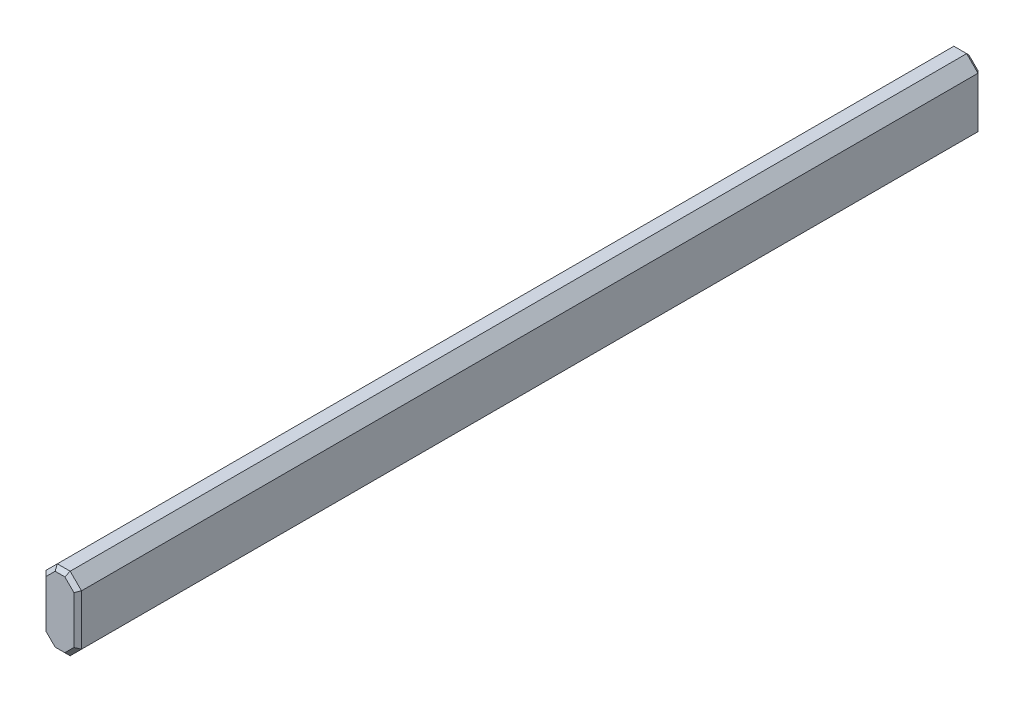
ISO-10303-21;
HEADER;
FILE_DESCRIPTION(('STEP AP214'),'2;1');
FILE_NAME('part.step','',(''),(''),'','','');
FILE_SCHEMA(('AUTOMOTIVE_DESIGN { 1 0 10303 214 1 1 1 1 }'));
ENDSEC;
DATA;
#1=APPLICATION_CONTEXT('core data for automotive mechanical design processes');
#2=APPLICATION_PROTOCOL_DEFINITION('international standard','automotive_design',2000,#1);
#3=PRODUCT_CONTEXT('',#1,'mechanical');
#4=PRODUCT('Part','Part','',(#3));
#5=PRODUCT_RELATED_PRODUCT_CATEGORY('part','',(#4));
#6=PRODUCT_DEFINITION_FORMATION('','',#4);
#7=PRODUCT_DEFINITION_CONTEXT('part definition',#1,'design');
#8=PRODUCT_DEFINITION('design','',#6,#7);
#9=PRODUCT_DEFINITION_SHAPE('','',#8);
#10=(LENGTH_UNIT() NAMED_UNIT(*) SI_UNIT(.MILLI.,.METRE.));
#11=(NAMED_UNIT(*) PLANE_ANGLE_UNIT() SI_UNIT($,.RADIAN.));
#12=(NAMED_UNIT(*) SI_UNIT($,.STERADIAN.) SOLID_ANGLE_UNIT());
#13=UNCERTAINTY_MEASURE_WITH_UNIT(LENGTH_MEASURE(1.E-05),#10,'distance_accuracy_value','');
#14=(GEOMETRIC_REPRESENTATION_CONTEXT(3) GLOBAL_UNCERTAINTY_ASSIGNED_CONTEXT((#13)) GLOBAL_UNIT_ASSIGNED_CONTEXT((#10,
#11,#12)) REPRESENTATION_CONTEXT('',''));
#15=CARTESIAN_POINT('',(0.,0.,0.));
#16=DIRECTION('',(0.,0.,1.));
#17=DIRECTION('',(1.,0.,0.));
#18=AXIS2_PLACEMENT_3D('',#15,#16,#17);
#19=CARTESIAN_POINT('',(2.35,-4.85,119.7));
#20=DIRECTION('',(-1.,0.,0.));
#21=DIRECTION('',(0.,-1.,0.));
#22=AXIS2_PLACEMENT_3D('',#19,#20,#21);
#23=PLANE('',#22);
#24=DIRECTION('',(0.,0.,1.));
#25=VECTOR('',#24,1.);
#26=CARTESIAN_POINT('',(2.35,3.34999999999999,119.7));
#27=LINE('',#26,#25);
#28=CARTESIAN_POINT('',(2.35,3.34999999999999,0.500000000000014));
#29=VERTEX_POINT('',#28);
#30=CARTESIAN_POINT('',(2.35,3.34999999999999,119.2));
#31=VERTEX_POINT('',#30);
#32=EDGE_CURVE('E307',#29,#31,#27,.T.);
#33=ORIENTED_EDGE('',*,*,#32,.T.);
#34=DIRECTION('',(0.,-1.,0.));
#35=VECTOR('',#34,1.);
#36=CARTESIAN_POINT('',(2.35,-3.35,119.2));
#37=LINE('',#36,#35);
#38=CARTESIAN_POINT('',(2.35,-3.35,119.2));
#39=VERTEX_POINT('',#38);
#40=EDGE_CURVE('E203',#31,#39,#37,.T.);
#41=ORIENTED_EDGE('',*,*,#40,.T.);
#42=DIRECTION('',(0.,0.,-1.));
#43=VECTOR('',#42,1.);
#44=CARTESIAN_POINT('',(2.35,-3.35,119.7));
#45=LINE('',#44,#43);
#46=CARTESIAN_POINT('',(2.35,-3.35,0.500000000000014));
#47=VERTEX_POINT('',#46);
#48=EDGE_CURVE('E179',#39,#47,#45,.T.);
#49=ORIENTED_EDGE('',*,*,#48,.T.);
#50=DIRECTION('',(0.,1.,0.));
#51=VECTOR('',#50,1.);
#52=CARTESIAN_POINT('',(2.35,-4.85,0.500000000000014));
#53=LINE('',#52,#51);
#54=EDGE_CURVE('E201',#47,#29,#53,.T.);
#55=ORIENTED_EDGE('',*,*,#54,.T.);
#56=EDGE_LOOP('',(#33,#41,#49,#55));
#57=FACE_BOUND('',#56,.T.);
#58=ADVANCED_FACE('F45',(#57),#23,.F.);
#59=CARTESIAN_POINT('',(2.35,4.85,119.7));
#60=DIRECTION('',(0.,-1.,0.));
#61=DIRECTION('',(1.,0.,0.));
#62=AXIS2_PLACEMENT_3D('',#59,#60,#61);
#63=PLANE('',#62);
#64=DIRECTION('',(0.,0.,1.));
#65=VECTOR('',#64,1.);
#66=CARTESIAN_POINT('',(-0.849999999999971,4.85,119.7));
#67=LINE('',#66,#65);
#68=CARTESIAN_POINT('',(-0.849999999999971,4.85,0.500000000000014));
#69=VERTEX_POINT('',#68);
#70=CARTESIAN_POINT('',(-0.849999999999971,4.85,119.2));
#71=VERTEX_POINT('',#70);
#72=EDGE_CURVE('E290',#69,#71,#67,.T.);
#73=ORIENTED_EDGE('',*,*,#72,.T.);
#74=DIRECTION('',(1.,0.,0.));
#75=VECTOR('',#74,1.);
#76=CARTESIAN_POINT('',(0.849999999999998,4.85,119.2));
#77=LINE('',#76,#75);
#78=CARTESIAN_POINT('',(0.849999999999998,4.85,119.2));
#79=VERTEX_POINT('',#78);
#80=EDGE_CURVE('E195',#71,#79,#77,.T.);
#81=ORIENTED_EDGE('',*,*,#80,.T.);
#82=DIRECTION('',(0.,0.,-1.));
#83=VECTOR('',#82,1.);
#84=CARTESIAN_POINT('',(0.849999999999998,4.85,119.7));
#85=LINE('',#84,#83);
#86=CARTESIAN_POINT('',(0.849999999999998,4.85,0.500000000000014));
#87=VERTEX_POINT('',#86);
#88=EDGE_CURVE('E298',#79,#87,#85,.T.);
#89=ORIENTED_EDGE('',*,*,#88,.T.);
#90=DIRECTION('',(-1.,0.,0.));
#91=VECTOR('',#90,1.);
#92=CARTESIAN_POINT('',(2.35,4.85,0.500000000000014));
#93=LINE('',#92,#91);
#94=EDGE_CURVE('E193',#87,#69,#93,.T.);
#95=ORIENTED_EDGE('',*,*,#94,.T.);
#96=EDGE_LOOP('',(#73,#81,#89,#95));
#97=FACE_BOUND('',#96,.T.);
#98=ADVANCED_FACE('F330',(#97),#63,.F.);
#99=CARTESIAN_POINT('',(-2.35,4.85,119.7));
#100=DIRECTION('',(1.,0.,0.));
#101=DIRECTION('',(0.,1.,0.));
#102=AXIS2_PLACEMENT_3D('',#99,#100,#101);
#103=PLANE('',#102);
#104=DIRECTION('',(0.,0.,1.));
#105=VECTOR('',#104,1.);
#106=CARTESIAN_POINT('',(-2.35,-3.35,119.7));
#107=LINE('',#106,#105);
#108=CARTESIAN_POINT('',(-2.35,-3.35,0.500000000000014));
#109=VERTEX_POINT('',#108);
#110=CARTESIAN_POINT('',(-2.35,-3.35,119.2));
#111=VERTEX_POINT('',#110);
#112=EDGE_CURVE('E295',#109,#111,#107,.T.);
#113=ORIENTED_EDGE('',*,*,#112,.T.);
#114=DIRECTION('',(0.,1.,0.));
#115=VECTOR('',#114,1.);
#116=CARTESIAN_POINT('',(-2.35,3.34999999999999,119.2));
#117=LINE('',#116,#115);
#118=CARTESIAN_POINT('',(-2.35,3.34999999999999,119.2));
#119=VERTEX_POINT('',#118);
#120=EDGE_CURVE('E220',#111,#119,#117,.T.);
#121=ORIENTED_EDGE('',*,*,#120,.T.);
#122=DIRECTION('',(0.,0.,-1.));
#123=VECTOR('',#122,1.);
#124=CARTESIAN_POINT('',(-2.35,3.34999999999999,119.7));
#125=LINE('',#124,#123);
#126=CARTESIAN_POINT('',(-2.35,3.34999999999999,0.500000000000014));
#127=VERTEX_POINT('',#126);
#128=EDGE_CURVE('E288',#119,#127,#125,.T.);
#129=ORIENTED_EDGE('',*,*,#128,.T.);
#130=DIRECTION('',(0.,-1.,0.));
#131=VECTOR('',#130,1.);
#132=CARTESIAN_POINT('',(-2.35,4.85,0.500000000000014));
#133=LINE('',#132,#131);
#134=EDGE_CURVE('E218',#127,#109,#133,.T.);
#135=ORIENTED_EDGE('',*,*,#134,.T.);
#136=EDGE_LOOP('',(#113,#121,#129,#135));
#137=FACE_BOUND('',#136,.T.);
#138=ADVANCED_FACE('F293',(#137),#103,.F.);
#139=CARTESIAN_POINT('',(-2.35,-4.85,119.7));
#140=DIRECTION('',(0.,1.,0.));
#141=DIRECTION('',(-1.,0.,0.));
#142=AXIS2_PLACEMENT_3D('',#139,#140,#141);
#143=PLANE('',#142);
#144=DIRECTION('',(0.,0.,1.));
#145=VECTOR('',#144,1.);
#146=CARTESIAN_POINT('',(0.849999999999985,-4.85,119.7));
#147=LINE('',#146,#145);
#148=CARTESIAN_POINT('',(0.849999999999985,-4.85,0.500000000000014));
#149=VERTEX_POINT('',#148);
#150=CARTESIAN_POINT('',(0.849999999999985,-4.85,119.2));
#151=VERTEX_POINT('',#150);
#152=EDGE_CURVE('E251',#149,#151,#147,.T.);
#153=ORIENTED_EDGE('',*,*,#152,.T.);
#154=DIRECTION('',(-1.,0.,0.));
#155=VECTOR('',#154,1.);
#156=CARTESIAN_POINT('',(-0.849999999999999,-4.85,119.2));
#157=LINE('',#156,#155);
#158=CARTESIAN_POINT('',(-0.849999999999999,-4.85,119.2));
#159=VERTEX_POINT('',#158);
#160=EDGE_CURVE('E212',#151,#159,#157,.T.);
#161=ORIENTED_EDGE('',*,*,#160,.T.);
#162=DIRECTION('',(0.,0.,-1.));
#163=VECTOR('',#162,1.);
#164=CARTESIAN_POINT('',(-0.849999999999999,-4.85,119.7));
#165=LINE('',#164,#163);
#166=CARTESIAN_POINT('',(-0.849999999999999,-4.85,0.500000000000014));
#167=VERTEX_POINT('',#166);
#168=EDGE_CURVE('E296',#159,#167,#165,.T.);
#169=ORIENTED_EDGE('',*,*,#168,.T.);
#170=DIRECTION('',(1.,0.,0.));
#171=VECTOR('',#170,1.);
#172=CARTESIAN_POINT('',(-2.35,-4.85,0.500000000000014));
#173=LINE('',#172,#171);
#174=EDGE_CURVE('E210',#167,#149,#173,.T.);
#175=ORIENTED_EDGE('',*,*,#174,.T.);
#176=EDGE_LOOP('',(#153,#161,#169,#175));
#177=FACE_BOUND('',#176,.T.);
#178=ADVANCED_FACE('F359',(#177),#143,.F.);
#179=CARTESIAN_POINT('',(0.,0.,119.7));
#180=DIRECTION('',(0.,0.,1.));
#181=DIRECTION('',(1.,0.,0.));
#182=AXIS2_PLACEMENT_3D('',#179,#180,#181);
#183=PLANE('',#182);
#184=DIRECTION('',(-1.,0.,0.));
#185=VECTOR('',#184,1.);
#186=CARTESIAN_POINT('',(-0.849999999999971,4.34999999999999,119.7));
#187=LINE('',#186,#185);
#188=CARTESIAN_POINT('',(0.642893218813443,4.34999999999999,119.7));
#189=VERTEX_POINT('',#188);
#190=CARTESIAN_POINT('',(-0.642893218813419,4.34999999999999,119.7));
#191=VERTEX_POINT('',#190);
#192=EDGE_CURVE('E183',#189,#191,#187,.T.);
#193=ORIENTED_EDGE('',*,*,#192,.T.);
#194=DIRECTION('',(-0.707106781186551,-0.707106781186544,0.));
#195=VECTOR('',#194,1.);
#196=CARTESIAN_POINT('',(-2.4964466094067,2.49644660940672,119.7));
#197=LINE('',#196,#195);
#198=CARTESIAN_POINT('',(-1.84999999999999,3.14289321881343,119.7));
#199=VERTEX_POINT('',#198);
#200=EDGE_CURVE('E164',#191,#199,#197,.T.);
#201=ORIENTED_EDGE('',*,*,#200,.T.);
#202=DIRECTION('',(0.,-1.,0.));
#203=VECTOR('',#202,1.);
#204=CARTESIAN_POINT('',(-1.84999999999999,-3.35,119.7));
#205=LINE('',#204,#203);
#206=CARTESIAN_POINT('',(-1.84999999999999,-3.14289321881344,119.7));
#207=VERTEX_POINT('',#206);
#208=EDGE_CURVE('E172',#199,#207,#205,.T.);
#209=ORIENTED_EDGE('',*,*,#208,.T.);
#210=DIRECTION('',(0.707106781186547,-0.707106781186548,0.));
#211=VECTOR('',#210,1.);
#212=CARTESIAN_POINT('',(-2.49644660940672,-2.49644660940671,119.7));
#213=LINE('',#212,#211);
#214=CARTESIAN_POINT('',(-0.642893218813444,-4.34999999999999,119.7));
#215=VERTEX_POINT('',#214);
#216=EDGE_CURVE('E178',#207,#215,#213,.T.);
#217=ORIENTED_EDGE('',*,*,#216,.T.);
#218=DIRECTION('',(1.,0.,0.));
#219=VECTOR('',#218,1.);
#220=CARTESIAN_POINT('',(0.849999999999985,-4.34999999999999,119.7));
#221=LINE('',#220,#219);
#222=CARTESIAN_POINT('',(0.642893218813431,-4.34999999999999,119.7));
#223=VERTEX_POINT('',#222);
#224=EDGE_CURVE('E313',#215,#223,#221,.T.);
#225=ORIENTED_EDGE('',*,*,#224,.T.);
#226=DIRECTION('',(0.707106781186551,0.707106781186544,0.));
#227=VECTOR('',#226,1.);
#228=CARTESIAN_POINT('',(2.49644660940671,-2.49644660940673,119.7));
#229=LINE('',#228,#227);
#230=CARTESIAN_POINT('',(1.84999999999999,-3.14289321881344,119.7));
#231=VERTEX_POINT('',#230);
#232=EDGE_CURVE('E315',#223,#231,#229,.T.);
#233=ORIENTED_EDGE('',*,*,#232,.T.);
#234=DIRECTION('',(0.,1.,0.));
#235=VECTOR('',#234,1.);
#236=CARTESIAN_POINT('',(1.84999999999999,3.34999999999999,119.7));
#237=LINE('',#236,#235);
#238=CARTESIAN_POINT('',(1.84999999999999,3.14289321881343,119.7));
#239=VERTEX_POINT('',#238);
#240=EDGE_CURVE('E317',#231,#239,#237,.T.);
#241=ORIENTED_EDGE('',*,*,#240,.T.);
#242=DIRECTION('',(-0.707106781186544,0.707106781186551,0.));
#243=VECTOR('',#242,1.);
#244=CARTESIAN_POINT('',(2.49644660940672,2.4964466094067,119.7));
#245=LINE('',#244,#243);
#246=EDGE_CURVE('E188',#239,#189,#245,.T.);
#247=ORIENTED_EDGE('',*,*,#246,.T.);
#248=EDGE_LOOP('',(#193,#201,#209,#217,#225,#233,#241,#247));
#249=FACE_BOUND('',#248,.T.);
#250=ADVANCED_FACE('F181',(#249),#183,.T.);
#251=CARTESIAN_POINT('',(0.,0.,0.));
#252=DIRECTION('',(0.,0.,1.));
#253=DIRECTION('',(1.,0.,0.));
#254=AXIS2_PLACEMENT_3D('',#251,#252,#253);
#255=PLANE('',#254);
#256=DIRECTION('',(0.,-1.,0.));
#257=VECTOR('',#256,1.);
#258=CARTESIAN_POINT('',(1.84999999999999,0.,0.));
#259=LINE('',#258,#257);
#260=CARTESIAN_POINT('',(1.84999999999999,3.14289321881343,0.));
#261=VERTEX_POINT('',#260);
#262=CARTESIAN_POINT('',(1.84999999999999,-3.14289321881344,0.));
#263=VERTEX_POINT('',#262);
#264=EDGE_CURVE('E55',#261,#263,#259,.T.);
#265=ORIENTED_EDGE('',*,*,#264,.T.);
#266=DIRECTION('',(-0.707106781186551,-0.707106781186544,0.));
#267=VECTOR('',#266,1.);
#268=CARTESIAN_POINT('',(0.496446609406702,-4.49644660940671,0.));
#269=LINE('',#268,#267);
#270=CARTESIAN_POINT('',(0.642893218813431,-4.34999999999999,0.));
#271=VERTEX_POINT('',#270);
#272=EDGE_CURVE('E11',#263,#271,#269,.T.);
#273=ORIENTED_EDGE('',*,*,#272,.T.);
#274=DIRECTION('',(-1.,0.,0.));
#275=VECTOR('',#274,1.);
#276=CARTESIAN_POINT('',(0.,-4.34999999999999,0.));
#277=LINE('',#276,#275);
#278=CARTESIAN_POINT('',(-0.642893218813444,-4.34999999999999,0.));
#279=VERTEX_POINT('',#278);
#280=EDGE_CURVE('E222',#271,#279,#277,.T.);
#281=ORIENTED_EDGE('',*,*,#280,.T.);
#282=DIRECTION('',(-0.707106781186547,0.707106781186548,0.));
#283=VECTOR('',#282,1.);
#284=CARTESIAN_POINT('',(-1.99644660940672,-2.99644660940671,0.));
#285=LINE('',#284,#283);
#286=CARTESIAN_POINT('',(-1.84999999999999,-3.14289321881344,0.));
#287=VERTEX_POINT('',#286);
#288=EDGE_CURVE('E224',#279,#287,#285,.T.);
#289=ORIENTED_EDGE('',*,*,#288,.T.);
#290=DIRECTION('',(0.,1.,0.));
#291=VECTOR('',#290,1.);
#292=CARTESIAN_POINT('',(-1.84999999999999,0.,0.));
#293=LINE('',#292,#291);
#294=CARTESIAN_POINT('',(-1.84999999999999,3.14289321881343,0.));
#295=VERTEX_POINT('',#294);
#296=EDGE_CURVE('E226',#287,#295,#293,.T.);
#297=ORIENTED_EDGE('',*,*,#296,.T.);
#298=DIRECTION('',(0.707106781186551,0.707106781186544,0.));
#299=VECTOR('',#298,1.);
#300=CARTESIAN_POINT('',(-0.496446609406689,4.49644660940672,0.));
#301=LINE('',#300,#299);
#302=CARTESIAN_POINT('',(-0.64289321881342,4.34999999999999,0.));
#303=VERTEX_POINT('',#302);
#304=EDGE_CURVE('E228',#295,#303,#301,.T.);
#305=ORIENTED_EDGE('',*,*,#304,.T.);
#306=DIRECTION('',(1.,0.,0.));
#307=VECTOR('',#306,1.);
#308=CARTESIAN_POINT('',(0.,4.34999999999999,0.));
#309=LINE('',#308,#307);
#310=CARTESIAN_POINT('',(0.642893218813444,4.34999999999999,0.));
#311=VERTEX_POINT('',#310);
#312=EDGE_CURVE('E230',#303,#311,#309,.T.);
#313=ORIENTED_EDGE('',*,*,#312,.T.);
#314=DIRECTION('',(0.707106781186544,-0.707106781186551,0.));
#315=VECTOR('',#314,1.);
#316=CARTESIAN_POINT('',(1.99644660940671,2.9964466094067,0.));
#317=LINE('',#316,#315);
#318=EDGE_CURVE('E66',#311,#261,#317,.T.);
#319=ORIENTED_EDGE('',*,*,#318,.T.);
#320=EDGE_LOOP('',(#265,#273,#281,#289,#297,#305,#313,#319));
#321=FACE_BOUND('',#320,.T.);
#322=ADVANCED_FACE('F346',(#321),#255,.F.);
#323=CARTESIAN_POINT('',(-0.849999999999999,-4.85,119.7));
#324=DIRECTION('',(0.707106781186548,0.707106781186547,0.));
#325=DIRECTION('',(0.,0.,-1.));
#326=AXIS2_PLACEMENT_3D('',#323,#324,#325);
#327=PLANE('',#326);
#328=ORIENTED_EDGE('',*,*,#168,.F.);
#329=DIRECTION('',(0.707106781186547,-0.707106781186548,0.));
#330=VECTOR('',#329,1.);
#331=CARTESIAN_POINT('',(-0.849999999999999,-4.85,119.2));
#332=LINE('',#331,#330);
#333=EDGE_CURVE('E216',#159,#111,#332,.F.);
#334=ORIENTED_EDGE('',*,*,#333,.T.);
#335=ORIENTED_EDGE('',*,*,#112,.F.);
#336=DIRECTION('',(-0.707106781186547,0.707106781186548,0.));
#337=VECTOR('',#336,1.);
#338=CARTESIAN_POINT('',(-0.849999999999999,-4.85,0.500000000000014));
#339=LINE('',#338,#337);
#340=EDGE_CURVE('E214',#109,#167,#339,.F.);
#341=ORIENTED_EDGE('',*,*,#340,.T.);
#342=EDGE_LOOP('',(#328,#334,#335,#341));
#343=FACE_BOUND('',#342,.T.);
#344=ADVANCED_FACE('F384',(#343),#327,.F.);
#345=CARTESIAN_POINT('',(-2.35,3.34999999999999,119.7));
#346=DIRECTION('',(0.707106781186544,-0.707106781186551,0.));
#347=DIRECTION('',(0.,0.,-1.));
#348=AXIS2_PLACEMENT_3D('',#345,#346,#347);
#349=PLANE('',#348);
#350=ORIENTED_EDGE('',*,*,#128,.F.);
#351=DIRECTION('',(-0.707106781186551,-0.707106781186544,0.));
#352=VECTOR('',#351,1.);
#353=CARTESIAN_POINT('',(-2.35,3.34999999999999,119.2));
#354=LINE('',#353,#352);
#355=EDGE_CURVE('E166',#119,#71,#354,.F.);
#356=ORIENTED_EDGE('',*,*,#355,.T.);
#357=ORIENTED_EDGE('',*,*,#72,.F.);
#358=DIRECTION('',(0.707106781186551,0.707106781186544,0.));
#359=VECTOR('',#358,1.);
#360=CARTESIAN_POINT('',(-2.35,3.34999999999999,0.500000000000014));
#361=LINE('',#360,#359);
#362=EDGE_CURVE('E185',#69,#127,#361,.F.);
#363=ORIENTED_EDGE('',*,*,#362,.T.);
#364=EDGE_LOOP('',(#350,#356,#357,#363));
#365=FACE_BOUND('',#364,.T.);
#366=ADVANCED_FACE('F287',(#365),#349,.F.);
#367=CARTESIAN_POINT('',(2.35,-3.35,119.7));
#368=DIRECTION('',(-0.707106781186544,0.707106781186551,0.));
#369=DIRECTION('',(0.,0.,-1.));
#370=AXIS2_PLACEMENT_3D('',#367,#368,#369);
#371=PLANE('',#370);
#372=ORIENTED_EDGE('',*,*,#48,.F.);
#373=DIRECTION('',(0.707106781186551,0.707106781186544,0.));
#374=VECTOR('',#373,1.);
#375=CARTESIAN_POINT('',(2.35,-3.35,119.2));
#376=LINE('',#375,#374);
#377=EDGE_CURVE('E208',#39,#151,#376,.F.);
#378=ORIENTED_EDGE('',*,*,#377,.T.);
#379=ORIENTED_EDGE('',*,*,#152,.F.);
#380=DIRECTION('',(-0.707106781186551,-0.707106781186544,0.));
#381=VECTOR('',#380,1.);
#382=CARTESIAN_POINT('',(2.35,-3.35,0.500000000000014));
#383=LINE('',#382,#381);
#384=EDGE_CURVE('E205',#149,#47,#383,.F.);
#385=ORIENTED_EDGE('',*,*,#384,.T.);
#386=EDGE_LOOP('',(#372,#378,#379,#385));
#387=FACE_BOUND('',#386,.T.);
#388=ADVANCED_FACE('F364',(#387),#371,.F.);
#389=CARTESIAN_POINT('',(0.849999999999999,4.85,119.7));
#390=DIRECTION('',(-0.707106781186551,-0.707106781186544,0.));
#391=DIRECTION('',(0.,0.,-1.));
#392=AXIS2_PLACEMENT_3D('',#389,#390,#391);
#393=PLANE('',#392);
#394=ORIENTED_EDGE('',*,*,#88,.F.);
#395=DIRECTION('',(-0.707106781186544,0.707106781186551,0.));
#396=VECTOR('',#395,1.);
#397=CARTESIAN_POINT('',(0.849999999999999,4.85,119.2));
#398=LINE('',#397,#396);
#399=EDGE_CURVE('E199',#79,#31,#398,.F.);
#400=ORIENTED_EDGE('',*,*,#399,.T.);
#401=ORIENTED_EDGE('',*,*,#32,.F.);
#402=DIRECTION('',(0.707106781186544,-0.707106781186551,0.));
#403=VECTOR('',#402,1.);
#404=CARTESIAN_POINT('',(0.849999999999999,4.85,0.500000000000014));
#405=LINE('',#404,#403);
#406=EDGE_CURVE('E197',#29,#87,#405,.F.);
#407=ORIENTED_EDGE('',*,*,#406,.T.);
#408=EDGE_LOOP('',(#394,#400,#401,#407));
#409=FACE_BOUND('',#408,.T.);
#410=ADVANCED_FACE('F332',(#409),#393,.F.);
#411=CARTESIAN_POINT('',(2.49644660940671,-2.49644660940673,119.7));
#412=DIRECTION('',(0.499999999999998,-0.500000000000002,0.707106781186548));
#413=DIRECTION('',(-0.707106781186551,-0.707106781186544,0.));
#414=AXIS2_PLACEMENT_3D('',#411,#412,#413);
#415=PLANE('',#414);
#416=DIRECTION('',(-0.281084637714821,0.678598344545846,0.678598344545848));
#417=VECTOR('',#416,1.);
#418=CARTESIAN_POINT('',(0.592099142644053,-4.22737225242366,119.822627747576));
#419=LINE('',#418,#417);
#420=EDGE_CURVE('E245',#151,#223,#419,.T.);
#421=ORIENTED_EDGE('',*,*,#420,.F.);
#422=ORIENTED_EDGE('',*,*,#377,.F.);
#423=DIRECTION('',(-0.678598344545847,0.281084637714822,0.678598344545847));
#424=VECTOR('',#423,1.);
#425=CARTESIAN_POINT('',(2.02438035847453,-3.21512392830508,119.525619641525));
#426=LINE('',#425,#424);
#427=EDGE_CURVE('E248',#231,#39,#426,.F.);
#428=ORIENTED_EDGE('',*,*,#427,.F.);
#429=ORIENTED_EDGE('',*,*,#232,.F.);
#430=EDGE_LOOP('',(#421,#422,#428,#429));
#431=FACE_BOUND('',#430,.T.);
#432=ADVANCED_FACE('F368',(#431),#415,.T.);
#433=CARTESIAN_POINT('',(1.84999999999999,0.,119.7));
#434=DIRECTION('',(0.707106781186548,0.,0.707106781186548));
#435=DIRECTION('',(0.,-1.,0.));
#436=AXIS2_PLACEMENT_3D('',#433,#434,#435);
#437=PLANE('',#436);
#438=ORIENTED_EDGE('',*,*,#427,.T.);
#439=ORIENTED_EDGE('',*,*,#40,.F.);
#440=DIRECTION('',(-0.678598344545847,-0.281084637714819,0.678598344545847));
#441=VECTOR('',#440,1.);
#442=CARTESIAN_POINT('',(1.2505133278473,2.89457770874588,120.299486672153));
#443=LINE('',#442,#441);
#444=EDGE_CURVE('E242',#239,#31,#443,.F.);
#445=ORIENTED_EDGE('',*,*,#444,.F.);
#446=ORIENTED_EDGE('',*,*,#240,.F.);
#447=EDGE_LOOP('',(#438,#439,#445,#446));
#448=FACE_BOUND('',#447,.T.);
#449=ADVANCED_FACE('F373',(#448),#437,.T.);
#450=CARTESIAN_POINT('',(0.,-4.34999999999999,119.7));
#451=DIRECTION('',(0.,-0.707106781186548,0.707106781186547));
#452=DIRECTION('',(-1.,0.,0.));
#453=AXIS2_PLACEMENT_3D('',#450,#451,#452);
#454=PLANE('',#453);
#455=ORIENTED_EDGE('',*,*,#420,.T.);
#456=ORIENTED_EDGE('',*,*,#224,.F.);
#457=DIRECTION('',(0.281084637714822,0.678598344545846,0.678598344545848));
#458=VECTOR('',#457,1.);
#459=CARTESIAN_POINT('',(-0.435786437626897,-3.84999999999999,120.2));
#460=LINE('',#459,#458);
#461=EDGE_CURVE('E239',#159,#215,#460,.T.);
#462=ORIENTED_EDGE('',*,*,#461,.F.);
#463=ORIENTED_EDGE('',*,*,#160,.F.);
#464=EDGE_LOOP('',(#455,#456,#462,#463));
#465=FACE_BOUND('',#464,.T.);
#466=ADVANCED_FACE('F434',(#465),#454,.T.);
#467=CARTESIAN_POINT('',(2.49644660940672,2.4964466094067,119.7));
#468=DIRECTION('',(0.500000000000002,0.499999999999998,0.707106781186548));
#469=DIRECTION('',(0.707106781186544,-0.707106781186551,0.));
#470=AXIS2_PLACEMENT_3D('',#467,#468,#469);
#471=PLANE('',#470);
#472=ORIENTED_EDGE('',*,*,#444,.T.);
#473=ORIENTED_EDGE('',*,*,#399,.F.);
#474=DIRECTION('',(-0.281084637714822,-0.678598344545847,0.678598344545847));
#475=VECTOR('',#474,1.);
#476=CARTESIAN_POINT('',(0.435786437626893,3.84999999999998,120.2));
#477=LINE('',#476,#475);
#478=EDGE_CURVE('E236',#189,#79,#477,.F.);
#479=ORIENTED_EDGE('',*,*,#478,.F.);
#480=ORIENTED_EDGE('',*,*,#246,.F.);
#481=EDGE_LOOP('',(#472,#473,#479,#480));
#482=FACE_BOUND('',#481,.T.);
#483=ADVANCED_FACE('F324',(#482),#471,.T.);
#484=CARTESIAN_POINT('',(-2.49644660940672,-2.49644660940671,119.7));
#485=DIRECTION('',(-0.5,-0.5,0.707106781186547));
#486=DIRECTION('',(-0.707106781186547,0.707106781186548,0.));
#487=AXIS2_PLACEMENT_3D('',#484,#485,#486);
#488=PLANE('',#487);
#489=ORIENTED_EDGE('',*,*,#461,.T.);
#490=ORIENTED_EDGE('',*,*,#216,.F.);
#491=DIRECTION('',(0.678598344545847,0.28108463771482,0.678598344545847));
#492=VECTOR('',#491,1.);
#493=CARTESIAN_POINT('',(-1.25051332784729,-2.89457770874589,120.299486672153));
#494=LINE('',#493,#492);
#495=EDGE_CURVE('E175',#111,#207,#494,.T.);
#496=ORIENTED_EDGE('',*,*,#495,.F.);
#497=ORIENTED_EDGE('',*,*,#333,.F.);
#498=EDGE_LOOP('',(#489,#490,#496,#497));
#499=FACE_BOUND('',#498,.T.);
#500=ADVANCED_FACE('F422',(#499),#488,.T.);
#501=CARTESIAN_POINT('',(0.,4.34999999999999,119.7));
#502=DIRECTION('',(0.,0.707106781186548,0.707106781186548));
#503=DIRECTION('',(1.,0.,0.));
#504=AXIS2_PLACEMENT_3D('',#501,#502,#503);
#505=PLANE('',#504);
#506=ORIENTED_EDGE('',*,*,#478,.T.);
#507=ORIENTED_EDGE('',*,*,#80,.F.);
#508=DIRECTION('',(0.281084637714819,-0.678598344545847,0.678598344545847));
#509=VECTOR('',#508,1.);
#510=CARTESIAN_POINT('',(-0.592099142644043,4.22737225242366,119.822627747576));
#511=LINE('',#510,#509);
#512=EDGE_CURVE('E169',#191,#71,#511,.F.);
#513=ORIENTED_EDGE('',*,*,#512,.F.);
#514=ORIENTED_EDGE('',*,*,#192,.F.);
#515=EDGE_LOOP('',(#506,#507,#513,#514));
#516=FACE_BOUND('',#515,.T.);
#517=ADVANCED_FACE('F327',(#516),#505,.T.);
#518=CARTESIAN_POINT('',(-1.84999999999999,0.,119.7));
#519=DIRECTION('',(-0.707106781186548,0.,0.707106781186548));
#520=DIRECTION('',(0.,1.,0.));
#521=AXIS2_PLACEMENT_3D('',#518,#519,#520);
#522=PLANE('',#521);
#523=ORIENTED_EDGE('',*,*,#495,.T.);
#524=ORIENTED_EDGE('',*,*,#208,.F.);
#525=DIRECTION('',(-0.678598344545847,0.281084637714822,-0.678598344545847));
#526=VECTOR('',#525,1.);
#527=CARTESIAN_POINT('',(-1.25051332784729,2.89457770874587,120.299486672153));
#528=LINE('',#527,#526);
#529=EDGE_CURVE('E160',#119,#199,#528,.F.);
#530=ORIENTED_EDGE('',*,*,#529,.F.);
#531=ORIENTED_EDGE('',*,*,#120,.F.);
#532=EDGE_LOOP('',(#523,#524,#530,#531));
#533=FACE_BOUND('',#532,.T.);
#534=ADVANCED_FACE('F173',(#533),#522,.T.);
#535=CARTESIAN_POINT('',(-2.4964466094067,2.49644660940672,119.7));
#536=DIRECTION('',(-0.499999999999998,0.500000000000002,0.707106781186548));
#537=DIRECTION('',(0.707106781186551,0.707106781186544,0.));
#538=AXIS2_PLACEMENT_3D('',#535,#536,#537);
#539=PLANE('',#538);
#540=ORIENTED_EDGE('',*,*,#512,.T.);
#541=ORIENTED_EDGE('',*,*,#355,.F.);
#542=ORIENTED_EDGE('',*,*,#529,.T.);
#543=ORIENTED_EDGE('',*,*,#200,.F.);
#544=EDGE_LOOP('',(#540,#541,#542,#543));
#545=FACE_BOUND('',#544,.T.);
#546=ADVANCED_FACE('F162',(#545),#539,.T.);
#547=CARTESIAN_POINT('',(-2.4964466094067,2.49644660940672,0.));
#548=DIRECTION('',(0.499999999999998,-0.500000000000002,0.707106781186548));
#549=DIRECTION('',(0.707106781186551,0.707106781186544,0.));
#550=AXIS2_PLACEMENT_3D('',#547,#548,#549);
#551=PLANE('',#550);
#552=DIRECTION('',(0.678598344545847,-0.281084637714822,-0.678598344545847));
#553=VECTOR('',#552,1.);
#554=CARTESIAN_POINT('',(-2.63611535474582,3.4685128603389,0.786115354745838));
#555=LINE('',#554,#553);
#556=EDGE_CURVE('E267',#127,#295,#555,.T.);
#557=ORIENTED_EDGE('',*,*,#556,.F.);
#558=ORIENTED_EDGE('',*,*,#362,.F.);
#559=DIRECTION('',(0.281084637714819,-0.678598344545847,-0.678598344545847));
#560=VECTOR('',#559,1.);
#561=CARTESIAN_POINT('',(-0.435786437626874,3.84999999999999,-0.499999999999996));
#562=LINE('',#561,#560);
#563=EDGE_CURVE('E50',#303,#69,#562,.F.);
#564=ORIENTED_EDGE('',*,*,#563,.F.);
#565=ORIENTED_EDGE('',*,*,#304,.F.);
#566=EDGE_LOOP('',(#557,#558,#564,#565));
#567=FACE_BOUND('',#566,.T.);
#568=ADVANCED_FACE('F48',(#567),#551,.F.);
#569=CARTESIAN_POINT('',(2.35,4.85,0.500000000000014));
#570=DIRECTION('',(0.,-0.707106781186548,0.707106781186548));
#571=DIRECTION('',(-1.,0.,0.));
#572=AXIS2_PLACEMENT_3D('',#569,#570,#571);
#573=PLANE('',#572);
#574=ORIENTED_EDGE('',*,*,#563,.T.);
#575=ORIENTED_EDGE('',*,*,#94,.F.);
#576=DIRECTION('',(-0.281084637714822,-0.678598344545847,-0.678598344545847));
#577=VECTOR('',#576,1.);
#578=CARTESIAN_POINT('',(0.968512860338907,5.13611535474582,0.786115354745836));
#579=LINE('',#578,#577);
#580=EDGE_CURVE('E265',#311,#87,#579,.F.);
#581=ORIENTED_EDGE('',*,*,#580,.F.);
#582=ORIENTED_EDGE('',*,*,#312,.F.);
#583=EDGE_LOOP('',(#574,#575,#581,#582));
#584=FACE_BOUND('',#583,.T.);
#585=ADVANCED_FACE('F278',(#584),#573,.F.);
#586=CARTESIAN_POINT('',(-2.35,4.85,0.500000000000014));
#587=DIRECTION('',(0.707106781186548,0.,0.707106781186548));
#588=DIRECTION('',(0.,-1.,0.));
#589=AXIS2_PLACEMENT_3D('',#586,#587,#588);
#590=PLANE('',#589);
#591=ORIENTED_EDGE('',*,*,#556,.T.);
#592=ORIENTED_EDGE('',*,*,#296,.F.);
#593=DIRECTION('',(0.678598344545847,0.28108463771482,-0.678598344545847));
#594=VECTOR('',#593,1.);
#595=CARTESIAN_POINT('',(-2.02438035847453,-3.21512392830508,0.174380358474546));
#596=LINE('',#595,#594);
#597=EDGE_CURVE('E262',#109,#287,#596,.T.);
#598=ORIENTED_EDGE('',*,*,#597,.F.);
#599=ORIENTED_EDGE('',*,*,#134,.F.);
#600=EDGE_LOOP('',(#591,#592,#598,#599));
#601=FACE_BOUND('',#600,.T.);
#602=ADVANCED_FACE('F475',(#601),#590,.F.);
#603=CARTESIAN_POINT('',(2.49644660940672,2.4964466094067,0.));
#604=DIRECTION('',(-0.500000000000002,-0.499999999999998,0.707106781186548));
#605=DIRECTION('',(0.707106781186544,-0.707106781186551,0.));
#606=AXIS2_PLACEMENT_3D('',#603,#604,#605);
#607=PLANE('',#606);
#608=ORIENTED_EDGE('',*,*,#580,.T.);
#609=ORIENTED_EDGE('',*,*,#406,.F.);
#610=DIRECTION('',(-0.678598344545847,-0.281084637714819,-0.678598344545847));
#611=VECTOR('',#610,1.);
#612=CARTESIAN_POINT('',(2.02438035847453,3.21512392830507,0.174380358474546));
#613=LINE('',#612,#611);
#614=EDGE_CURVE('E259',#261,#29,#613,.F.);
#615=ORIENTED_EDGE('',*,*,#614,.F.);
#616=ORIENTED_EDGE('',*,*,#318,.F.);
#617=EDGE_LOOP('',(#608,#609,#615,#616));
#618=FACE_BOUND('',#617,.T.);
#619=ADVANCED_FACE('F336',(#618),#607,.F.);
#620=CARTESIAN_POINT('',(-2.49644660940672,-2.49644660940671,0.));
#621=DIRECTION('',(0.5,0.5,0.707106781186547));
#622=DIRECTION('',(-0.707106781186547,0.707106781186548,0.));
#623=AXIS2_PLACEMENT_3D('',#620,#621,#622);
#624=PLANE('',#623);
#625=ORIENTED_EDGE('',*,*,#597,.T.);
#626=ORIENTED_EDGE('',*,*,#288,.F.);
#627=DIRECTION('',(0.281084637714822,0.678598344545846,-0.678598344545848));
#628=VECTOR('',#627,1.);
#629=CARTESIAN_POINT('',(-0.968512860338908,-5.13611535474582,0.786115354745836));
#630=LINE('',#629,#628);
#631=EDGE_CURVE('E256',#167,#279,#630,.T.);
#632=ORIENTED_EDGE('',*,*,#631,.F.);
#633=ORIENTED_EDGE('',*,*,#340,.F.);
#634=EDGE_LOOP('',(#625,#626,#632,#633));
#635=FACE_BOUND('',#634,.T.);
#636=ADVANCED_FACE('F351',(#635),#624,.F.);
#637=CARTESIAN_POINT('',(2.35,-4.85,0.500000000000014));
#638=DIRECTION('',(-0.707106781186548,0.,0.707106781186548));
#639=DIRECTION('',(0.,1.,0.));
#640=AXIS2_PLACEMENT_3D('',#637,#638,#639);
#641=PLANE('',#640);
#642=ORIENTED_EDGE('',*,*,#614,.T.);
#643=ORIENTED_EDGE('',*,*,#54,.F.);
#644=DIRECTION('',(-0.678598344545847,0.281084637714822,-0.678598344545847));
#645=VECTOR('',#644,1.);
#646=CARTESIAN_POINT('',(2.63611535474582,-3.46851286033891,0.786115354745836));
#647=LINE('',#646,#645);
#648=EDGE_CURVE('E254',#263,#47,#647,.F.);
#649=ORIENTED_EDGE('',*,*,#648,.F.);
#650=ORIENTED_EDGE('',*,*,#264,.F.);
#651=EDGE_LOOP('',(#642,#643,#649,#650));
#652=FACE_BOUND('',#651,.T.);
#653=ADVANCED_FACE('F339',(#652),#641,.F.);
#654=CARTESIAN_POINT('',(-2.35,-4.85,0.500000000000014));
#655=DIRECTION('',(0.,0.707106781186548,0.707106781186547));
#656=DIRECTION('',(1.,0.,0.));
#657=AXIS2_PLACEMENT_3D('',#654,#655,#656);
#658=PLANE('',#657);
#659=ORIENTED_EDGE('',*,*,#631,.T.);
#660=ORIENTED_EDGE('',*,*,#280,.F.);
#661=DIRECTION('',(0.281084637714821,-0.678598344545846,0.678598344545848));
#662=VECTOR('',#661,1.);
#663=CARTESIAN_POINT('',(0.597172564610316,-4.23962057654225,-0.110379423457732));
#664=LINE('',#663,#662);
#665=EDGE_CURVE('E252',#149,#271,#664,.F.);
#666=ORIENTED_EDGE('',*,*,#665,.F.);
#667=ORIENTED_EDGE('',*,*,#174,.F.);
#668=EDGE_LOOP('',(#659,#660,#666,#667));
#669=FACE_BOUND('',#668,.T.);
#670=ADVANCED_FACE('F355',(#669),#658,.F.);
#671=CARTESIAN_POINT('',(2.49644660940671,-2.49644660940673,0.));
#672=DIRECTION('',(-0.499999999999998,0.500000000000002,0.707106781186548));
#673=DIRECTION('',(-0.707106781186551,-0.707106781186544,0.));
#674=AXIS2_PLACEMENT_3D('',#671,#672,#673);
#675=PLANE('',#674);
#676=ORIENTED_EDGE('',*,*,#648,.T.);
#677=ORIENTED_EDGE('',*,*,#384,.F.);
#678=ORIENTED_EDGE('',*,*,#665,.T.);
#679=ORIENTED_EDGE('',*,*,#272,.F.);
#680=EDGE_LOOP('',(#676,#677,#678,#679));
#681=FACE_BOUND('',#680,.T.);
#682=ADVANCED_FACE('F343',(#681),#675,.F.);
#683=CLOSED_SHELL('',(#58,#98,#138,#178,#250,#322,#344,#366,#388,#410,#432,#449,#466,#483,#500,
#517,#534,#546,#568,#585,#602,#619,#636,#653,#670,#682));
#684=MANIFOLD_SOLID_BREP('B2',#683);
#685=ADVANCED_BREP_SHAPE_REPRESENTATION('',(#18,#684),#14);
#686=SHAPE_DEFINITION_REPRESENTATION(#9,#685);
ENDSEC;
END-ISO-10303-21;
